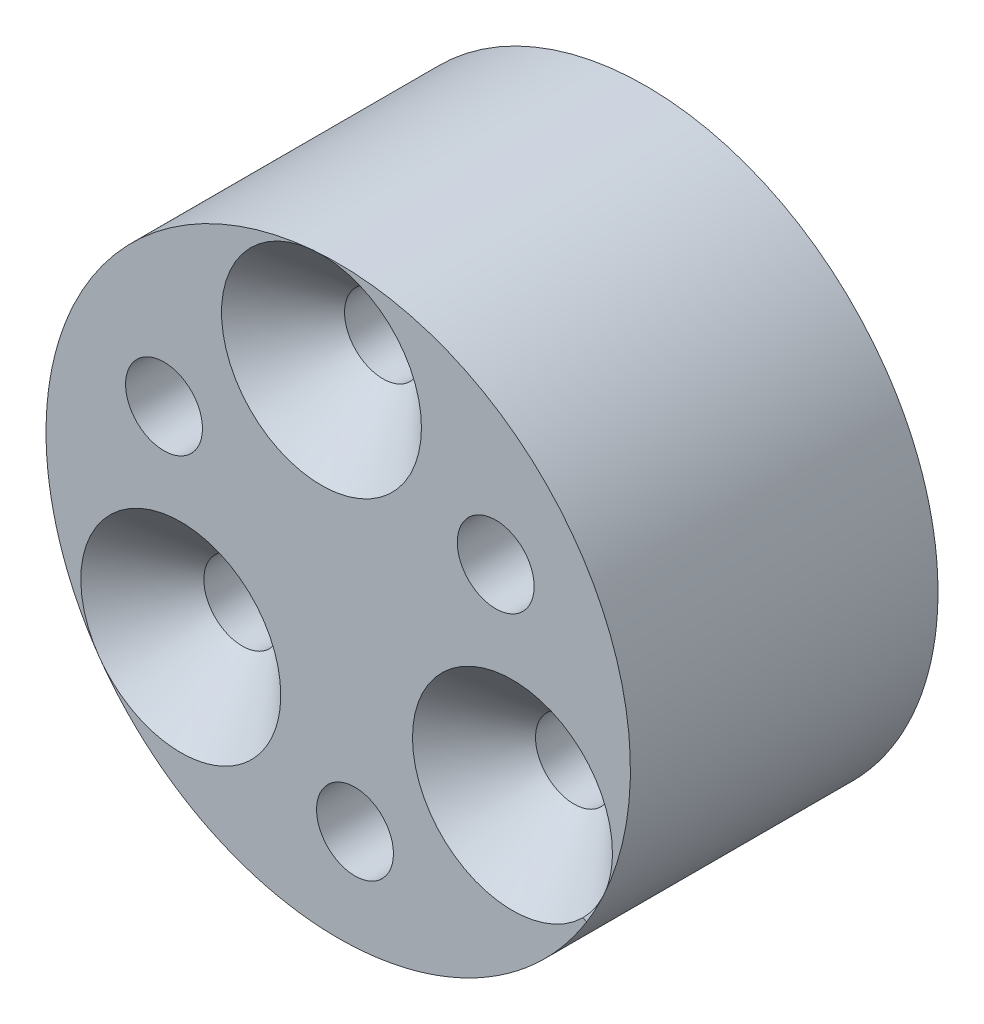
ISO-10303-21;
HEADER;
FILE_DESCRIPTION(('STEP AP214'),'2;1');
FILE_NAME('part.step','',(''),(''),'','','');
FILE_SCHEMA(('AUTOMOTIVE_DESIGN { 1 0 10303 214 1 1 1 1 }'));
ENDSEC;
DATA;
#1=APPLICATION_CONTEXT('core data for automotive mechanical design processes');
#2=APPLICATION_PROTOCOL_DEFINITION('international standard','automotive_design',2000,#1);
#3=PRODUCT_CONTEXT('',#1,'mechanical');
#4=PRODUCT('Part','Part','',(#3));
#5=PRODUCT_RELATED_PRODUCT_CATEGORY('part','',(#4));
#6=PRODUCT_DEFINITION_FORMATION('','',#4);
#7=PRODUCT_DEFINITION_CONTEXT('part definition',#1,'design');
#8=PRODUCT_DEFINITION('design','',#6,#7);
#9=PRODUCT_DEFINITION_SHAPE('','',#8);
#10=(LENGTH_UNIT() NAMED_UNIT(*) SI_UNIT(.MILLI.,.METRE.));
#11=(NAMED_UNIT(*) PLANE_ANGLE_UNIT() SI_UNIT($,.RADIAN.));
#12=(NAMED_UNIT(*) SI_UNIT($,.STERADIAN.) SOLID_ANGLE_UNIT());
#13=UNCERTAINTY_MEASURE_WITH_UNIT(LENGTH_MEASURE(1.E-05),#10,'distance_accuracy_value','');
#14=(GEOMETRIC_REPRESENTATION_CONTEXT(3) GLOBAL_UNCERTAINTY_ASSIGNED_CONTEXT((#13)) GLOBAL_UNIT_ASSIGNED_CONTEXT((#10,
#11,#12)) REPRESENTATION_CONTEXT('',''));
#15=CARTESIAN_POINT('',(0.,0.,0.));
#16=DIRECTION('',(0.,0.,1.));
#17=DIRECTION('',(1.,0.,0.));
#18=AXIS2_PLACEMENT_3D('',#15,#16,#17);
#19=CARTESIAN_POINT('',(0.,-40.,10.));
#20=DIRECTION('',(0.,0.,1.));
#21=DIRECTION('',(1.,0.,0.));
#22=AXIS2_PLACEMENT_3D('',#19,#20,#21);
#23=PLANE('',#22);
#24=CARTESIAN_POINT('',(-5.66442366897909,-37.3586358641206,10.));
#25=DIRECTION('',(0.,0.,1.));
#26=DIRECTION('',(1.,0.,0.));
#27=AXIS2_PLACEMENT_3D('',#24,#25,#26);
#28=CIRCLE('',#27,1.25);
#29=CARTESIAN_POINT('',(-4.41442366897909,-37.3586358641206,10.));
#30=VERTEX_POINT('',#29);
#31=EDGE_CURVE('E178',#30,#30,#28,.T.);
#32=ORIENTED_EDGE('',*,*,#31,.F.);
#33=EDGE_LOOP('',(#32));
#34=FACE_BOUND('',#33,.T.);
#35=CARTESIAN_POINT('',(5.1197002768062,-36.415147272806,10.));
#36=DIRECTION('',(0.,0.,1.));
#37=DIRECTION('',(1.,0.,0.));
#38=AXIS2_PLACEMENT_3D('',#35,#36,#37);
#39=CIRCLE('',#38,1.25);
#40=CARTESIAN_POINT('',(6.3697002768062,-36.415147272806,10.));
#41=VERTEX_POINT('',#40);
#42=EDGE_CURVE('E184',#41,#41,#39,.T.);
#43=ORIENTED_EDGE('',*,*,#42,.F.);
#44=EDGE_LOOP('',(#43));
#45=FACE_BOUND('',#44,.T.);
#46=CARTESIAN_POINT('',(0.,-40.,10.));
#47=DIRECTION('',(0.,0.,1.));
#48=DIRECTION('',(1.,0.,0.));
#49=AXIS2_PLACEMENT_3D('',#46,#47,#48);
#50=CIRCLE('',#49,9.5);
#51=CARTESIAN_POINT('',(8.60992397684817,-44.0148734865367,10.));
#52=VERTEX_POINT('',#51);
#53=CARTESIAN_POINT('',(-0.827979556102756,-30.5361503681284,10.));
#54=VERTEX_POINT('',#53);
#55=EDGE_CURVE('E192',#52,#54,#50,.T.);
#56=ORIENTED_EDGE('',*,*,#55,.T.);
#57=CARTESIAN_POINT('',(-0.544723392172868,-33.7737831369266,10.));
#58=DIRECTION('',(0.,0.,1.));
#59=DIRECTION('',(1.,0.,0.));
#60=AXIS2_PLACEMENT_3D('',#57,#58,#59);
#61=CIRCLE('',#60,3.25000000000001);
#62=EDGE_CURVE('E68',#54,#54,#61,.F.);
#63=ORIENTED_EDGE('',*,*,#62,.T.);
#64=CARTESIAN_POINT('',(-7.78194442074542,-45.4489761453349,10.));
#65=VERTEX_POINT('',#64);
#66=EDGE_CURVE('E188',#54,#65,#50,.T.);
#67=ORIENTED_EDGE('',*,*,#66,.T.);
#68=CARTESIAN_POINT('',(-5.11970027680621,-43.584852727194,10.));
#69=DIRECTION('',(0.,0.,1.));
#70=DIRECTION('',(1.,0.,0.));
#71=AXIS2_PLACEMENT_3D('',#68,#69,#70);
#72=CIRCLE('',#71,3.25000000000001);
#73=EDGE_CURVE('E75',#65,#65,#72,.F.);
#74=ORIENTED_EDGE('',*,*,#73,.T.);
#75=EDGE_CURVE('E191',#65,#52,#50,.T.);
#76=ORIENTED_EDGE('',*,*,#75,.T.);
#77=CARTESIAN_POINT('',(5.66442366897907,-42.6413641358794,10.));
#78=DIRECTION('',(0.,0.,1.));
#79=DIRECTION('',(1.,0.,0.));
#80=AXIS2_PLACEMENT_3D('',#77,#78,#79);
#81=CIRCLE('',#80,3.25000000000001);
#82=EDGE_CURVE('E81',#52,#52,#81,.F.);
#83=ORIENTED_EDGE('',*,*,#82,.T.);
#84=EDGE_LOOP('',(#56,#63,#67,#74,#76,#83));
#85=FACE_BOUND('',#84,.T.);
#86=CARTESIAN_POINT('',(0.544723392172861,-46.2262168630734,10.));
#87=DIRECTION('',(0.,0.,1.));
#88=DIRECTION('',(1.,0.,0.));
#89=AXIS2_PLACEMENT_3D('',#86,#87,#88);
#90=CIRCLE('',#89,1.25);
#91=CARTESIAN_POINT('',(1.79472339217286,-46.2262168630734,10.));
#92=VERTEX_POINT('',#91);
#93=EDGE_CURVE('E181',#92,#92,#90,.T.);
#94=ORIENTED_EDGE('',*,*,#93,.F.);
#95=EDGE_LOOP('',(#94));
#96=FACE_BOUND('',#95,.T.);
#97=ADVANCED_FACE('F35',(#34,#45,#85,#96),#23,.T.);
#98=CARTESIAN_POINT('',(0.,-40.,0.));
#99=DIRECTION('',(0.,0.,1.));
#100=DIRECTION('',(1.,0.,0.));
#101=AXIS2_PLACEMENT_3D('',#98,#99,#100);
#102=PLANE('',#101);
#103=CARTESIAN_POINT('',(0.,-40.,0.));
#104=DIRECTION('',(0.,0.,1.));
#105=DIRECTION('',(1.,0.,0.));
#106=AXIS2_PLACEMENT_3D('',#103,#104,#105);
#107=CIRCLE('',#106,9.5);
#108=CARTESIAN_POINT('',(-8.60992397684818,-35.9851265134634,0.));
#109=VERTEX_POINT('',#108);
#110=CARTESIAN_POINT('',(0.827979556102749,-49.4638496318716,0.));
#111=VERTEX_POINT('',#110);
#112=EDGE_CURVE('E196',#109,#111,#107,.T.);
#113=ORIENTED_EDGE('',*,*,#112,.F.);
#114=CARTESIAN_POINT('',(-5.66442366897909,-37.3586358641206,0.));
#115=DIRECTION('',(0.,0.,1.));
#116=DIRECTION('',(1.,0.,0.));
#117=AXIS2_PLACEMENT_3D('',#114,#115,#116);
#118=CIRCLE('',#117,3.25);
#119=EDGE_CURVE('E54',#109,#109,#118,.T.);
#120=ORIENTED_EDGE('',*,*,#119,.T.);
#121=CARTESIAN_POINT('',(7.78194442074543,-34.5510238546651,0.));
#122=VERTEX_POINT('',#121);
#123=EDGE_CURVE('E193',#122,#109,#107,.T.);
#124=ORIENTED_EDGE('',*,*,#123,.F.);
#125=CARTESIAN_POINT('',(5.1197002768062,-36.415147272806,0.));
#126=DIRECTION('',(0.,0.,1.));
#127=DIRECTION('',(1.,0.,0.));
#128=AXIS2_PLACEMENT_3D('',#125,#126,#127);
#129=CIRCLE('',#128,3.25);
#130=EDGE_CURVE('E87',#122,#122,#129,.T.);
#131=ORIENTED_EDGE('',*,*,#130,.T.);
#132=EDGE_CURVE('E187',#111,#122,#107,.T.);
#133=ORIENTED_EDGE('',*,*,#132,.F.);
#134=CARTESIAN_POINT('',(0.544723392172861,-46.2262168630734,0.));
#135=DIRECTION('',(0.,0.,1.));
#136=DIRECTION('',(1.,0.,0.));
#137=AXIS2_PLACEMENT_3D('',#134,#135,#136);
#138=CIRCLE('',#137,3.25);
#139=EDGE_CURVE('E49',#111,#111,#138,.T.);
#140=ORIENTED_EDGE('',*,*,#139,.T.);
#141=EDGE_LOOP('',(#113,#120,#124,#131,#133,#140));
#142=FACE_BOUND('',#141,.T.);
#143=CARTESIAN_POINT('',(-5.11970027680621,-43.584852727194,0.));
#144=DIRECTION('',(0.,0.,1.));
#145=DIRECTION('',(1.,0.,0.));
#146=AXIS2_PLACEMENT_3D('',#143,#144,#145);
#147=CIRCLE('',#146,1.25);
#148=CARTESIAN_POINT('',(-3.86970027680621,-43.584852727194,0.));
#149=VERTEX_POINT('',#148);
#150=EDGE_CURVE('E173',#149,#149,#147,.T.);
#151=ORIENTED_EDGE('',*,*,#150,.T.);
#152=EDGE_LOOP('',(#151));
#153=FACE_BOUND('',#152,.T.);
#154=CARTESIAN_POINT('',(-0.544723392172868,-33.7737831369266,0.));
#155=DIRECTION('',(0.,0.,1.));
#156=DIRECTION('',(1.,0.,0.));
#157=AXIS2_PLACEMENT_3D('',#154,#155,#156);
#158=CIRCLE('',#157,1.25);
#159=CARTESIAN_POINT('',(0.705276607827134,-33.7737831369266,0.));
#160=VERTEX_POINT('',#159);
#161=EDGE_CURVE('E170',#160,#160,#158,.T.);
#162=ORIENTED_EDGE('',*,*,#161,.T.);
#163=EDGE_LOOP('',(#162));
#164=FACE_BOUND('',#163,.T.);
#165=CARTESIAN_POINT('',(5.66442366897907,-42.6413641358794,0.));
#166=DIRECTION('',(0.,0.,1.));
#167=DIRECTION('',(1.,0.,0.));
#168=AXIS2_PLACEMENT_3D('',#165,#166,#167);
#169=CIRCLE('',#168,1.25);
#170=CARTESIAN_POINT('',(6.91442366897907,-42.6413641358794,0.));
#171=VERTEX_POINT('',#170);
#172=EDGE_CURVE('E168',#171,#171,#169,.T.);
#173=ORIENTED_EDGE('',*,*,#172,.T.);
#174=EDGE_LOOP('',(#173));
#175=FACE_BOUND('',#174,.T.);
#176=ADVANCED_FACE('F113',(#142,#153,#164,#175),#102,.F.);
#177=CARTESIAN_POINT('',(0.,-40.,10.));
#178=DIRECTION('',(0.,0.,-1.));
#179=DIRECTION('',(-1.,0.,0.));
#180=AXIS2_PLACEMENT_3D('',#177,#178,#179);
#181=CYLINDRICAL_SURFACE('',#180,9.5);
#182=ORIENTED_EDGE('',*,*,#66,.F.);
#183=ORIENTED_EDGE('',*,*,#55,.F.);
#184=ORIENTED_EDGE('',*,*,#75,.F.);
#185=EDGE_LOOP('',(#182,#183,#184));
#186=FACE_BOUND('',#185,.T.);
#187=ORIENTED_EDGE('',*,*,#123,.T.);
#188=ORIENTED_EDGE('',*,*,#112,.T.);
#189=ORIENTED_EDGE('',*,*,#132,.T.);
#190=EDGE_LOOP('',(#187,#188,#189));
#191=FACE_BOUND('',#190,.T.);
#192=ADVANCED_FACE('F119',(#186,#191),#181,.T.);
#193=CARTESIAN_POINT('',(5.1197002768062,-36.415147272806,10.));
#194=DIRECTION('',(0.,0.,-1.));
#195=DIRECTION('',(-1.,0.,0.));
#196=AXIS2_PLACEMENT_3D('',#193,#194,#195);
#197=CYLINDRICAL_SURFACE('',#196,1.25);
#198=CARTESIAN_POINT('',(5.1197002768062,-36.415147272806,2.00000000000001));
#199=DIRECTION('',(0.,0.,1.));
#200=DIRECTION('',(1.,0.,0.));
#201=AXIS2_PLACEMENT_3D('',#198,#199,#200);
#202=CIRCLE('',#201,1.25);
#203=CARTESIAN_POINT('',(6.3697002768062,-36.415147272806,2.00000000000001));
#204=VERTEX_POINT('',#203);
#205=EDGE_CURVE('E11',#204,#204,#202,.F.);
#206=ORIENTED_EDGE('',*,*,#205,.T.);
#207=EDGE_LOOP('',(#206));
#208=FACE_BOUND('',#207,.T.);
#209=ORIENTED_EDGE('',*,*,#42,.T.);
#210=EDGE_LOOP('',(#209));
#211=FACE_BOUND('',#210,.T.);
#212=ADVANCED_FACE('F125',(#208,#211),#197,.F.);
#213=CARTESIAN_POINT('',(0.544723392172861,-46.2262168630734,10.));
#214=DIRECTION('',(0.,0.,-1.));
#215=DIRECTION('',(-1.,0.,0.));
#216=AXIS2_PLACEMENT_3D('',#213,#214,#215);
#217=CYLINDRICAL_SURFACE('',#216,1.25);
#218=CARTESIAN_POINT('',(0.544723392172861,-46.2262168630734,2.00000000000001));
#219=DIRECTION('',(0.,0.,1.));
#220=DIRECTION('',(1.,0.,0.));
#221=AXIS2_PLACEMENT_3D('',#218,#219,#220);
#222=CIRCLE('',#221,1.25);
#223=CARTESIAN_POINT('',(1.79472339217286,-46.2262168630734,2.00000000000001));
#224=VERTEX_POINT('',#223);
#225=EDGE_CURVE('E44',#224,#224,#222,.F.);
#226=ORIENTED_EDGE('',*,*,#225,.T.);
#227=EDGE_LOOP('',(#226));
#228=FACE_BOUND('',#227,.T.);
#229=ORIENTED_EDGE('',*,*,#93,.T.);
#230=EDGE_LOOP('',(#229));
#231=FACE_BOUND('',#230,.T.);
#232=ADVANCED_FACE('F97',(#228,#231),#217,.F.);
#233=CARTESIAN_POINT('',(-5.66442366897909,-37.3586358641206,10.));
#234=DIRECTION('',(0.,0.,-1.));
#235=DIRECTION('',(-1.,0.,0.));
#236=AXIS2_PLACEMENT_3D('',#233,#234,#235);
#237=CYLINDRICAL_SURFACE('',#236,1.25);
#238=CARTESIAN_POINT('',(-5.66442366897909,-37.3586358641206,2.00000000000001));
#239=DIRECTION('',(0.,0.,1.));
#240=DIRECTION('',(1.,0.,0.));
#241=AXIS2_PLACEMENT_3D('',#238,#239,#240);
#242=CIRCLE('',#241,1.25);
#243=CARTESIAN_POINT('',(-4.41442366897909,-37.3586358641206,2.00000000000001));
#244=VERTEX_POINT('',#243);
#245=EDGE_CURVE('E92',#244,#244,#242,.F.);
#246=ORIENTED_EDGE('',*,*,#245,.T.);
#247=EDGE_LOOP('',(#246));
#248=FACE_BOUND('',#247,.T.);
#249=ORIENTED_EDGE('',*,*,#31,.T.);
#250=EDGE_LOOP('',(#249));
#251=FACE_BOUND('',#250,.T.);
#252=ADVANCED_FACE('F210',(#248,#251),#237,.F.);
#253=CARTESIAN_POINT('',(-5.11970027680621,-43.584852727194,10.));
#254=DIRECTION('',(0.,0.,-1.));
#255=DIRECTION('',(-1.,0.,0.));
#256=AXIS2_PLACEMENT_3D('',#253,#254,#255);
#257=CYLINDRICAL_SURFACE('',#256,1.25);
#258=CARTESIAN_POINT('',(-5.11970027680621,-43.584852727194,7.99999999999999));
#259=DIRECTION('',(0.,0.,1.));
#260=DIRECTION('',(1.,0.,0.));
#261=AXIS2_PLACEMENT_3D('',#258,#259,#260);
#262=CIRCLE('',#261,1.25);
#263=CARTESIAN_POINT('',(-3.86970027680621,-43.584852727194,7.99999999999999));
#264=VERTEX_POINT('',#263);
#265=EDGE_CURVE('E74',#264,#264,#262,.T.);
#266=ORIENTED_EDGE('',*,*,#265,.T.);
#267=EDGE_LOOP('',(#266));
#268=FACE_BOUND('',#267,.T.);
#269=ORIENTED_EDGE('',*,*,#150,.F.);
#270=EDGE_LOOP('',(#269));
#271=FACE_BOUND('',#270,.T.);
#272=ADVANCED_FACE('F207',(#268,#271),#257,.F.);
#273=CARTESIAN_POINT('',(-0.544723392172868,-33.7737831369266,10.));
#274=DIRECTION('',(0.,0.,-1.));
#275=DIRECTION('',(-1.,0.,0.));
#276=AXIS2_PLACEMENT_3D('',#273,#274,#275);
#277=CYLINDRICAL_SURFACE('',#276,1.25);
#278=CARTESIAN_POINT('',(-0.544723392172868,-33.7737831369266,8.00000000000001));
#279=DIRECTION('',(0.,0.,1.));
#280=DIRECTION('',(1.,0.,0.));
#281=AXIS2_PLACEMENT_3D('',#278,#279,#280);
#282=CIRCLE('',#281,1.25);
#283=CARTESIAN_POINT('',(0.705276607827134,-33.7737831369266,8.00000000000001));
#284=VERTEX_POINT('',#283);
#285=EDGE_CURVE('E190',#284,#284,#282,.T.);
#286=ORIENTED_EDGE('',*,*,#285,.T.);
#287=EDGE_LOOP('',(#286));
#288=FACE_BOUND('',#287,.T.);
#289=ORIENTED_EDGE('',*,*,#161,.F.);
#290=EDGE_LOOP('',(#289));
#291=FACE_BOUND('',#290,.T.);
#292=ADVANCED_FACE('F164',(#288,#291),#277,.F.);
#293=CARTESIAN_POINT('',(5.66442366897907,-42.6413641358794,10.));
#294=DIRECTION('',(0.,0.,-1.));
#295=DIRECTION('',(-1.,0.,0.));
#296=AXIS2_PLACEMENT_3D('',#293,#294,#295);
#297=CYLINDRICAL_SURFACE('',#296,1.25);
#298=CARTESIAN_POINT('',(5.66442366897907,-42.6413641358794,7.99999999999999));
#299=DIRECTION('',(0.,0.,1.));
#300=DIRECTION('',(1.,0.,0.));
#301=AXIS2_PLACEMENT_3D('',#298,#299,#300);
#302=CIRCLE('',#301,1.25);
#303=CARTESIAN_POINT('',(6.91442366897907,-42.6413641358794,7.99999999999999));
#304=VERTEX_POINT('',#303);
#305=EDGE_CURVE('E78',#304,#304,#302,.T.);
#306=ORIENTED_EDGE('',*,*,#305,.T.);
#307=EDGE_LOOP('',(#306));
#308=FACE_BOUND('',#307,.T.);
#309=ORIENTED_EDGE('',*,*,#172,.F.);
#310=EDGE_LOOP('',(#309));
#311=FACE_BOUND('',#310,.T.);
#312=ADVANCED_FACE('F138',(#308,#311),#297,.F.);
#313=CARTESIAN_POINT('',(-0.544723392172868,-33.7737831369266,8.00000000000001));
#314=DIRECTION('',(0.,0.,1.));
#315=DIRECTION('',(1.,0.,0.));
#316=AXIS2_PLACEMENT_3D('',#313,#314,#315);
#317=CONICAL_SURFACE('',#316,1.25,0.785398163397451);
#318=ORIENTED_EDGE('',*,*,#62,.F.);
#319=EDGE_LOOP('',(#318));
#320=FACE_BOUND('',#319,.T.);
#321=ORIENTED_EDGE('',*,*,#285,.F.);
#322=EDGE_LOOP('',(#321));
#323=FACE_BOUND('',#322,.T.);
#324=ADVANCED_FACE('F69',(#320,#323),#317,.F.);
#325=CARTESIAN_POINT('',(-5.11970027680621,-43.584852727194,7.99999999999999));
#326=DIRECTION('',(0.,0.,1.));
#327=DIRECTION('',(1.,0.,0.));
#328=AXIS2_PLACEMENT_3D('',#325,#326,#327);
#329=CONICAL_SURFACE('',#328,1.25,0.78539816339745);
#330=ORIENTED_EDGE('',*,*,#73,.F.);
#331=EDGE_LOOP('',(#330));
#332=FACE_BOUND('',#331,.T.);
#333=ORIENTED_EDGE('',*,*,#265,.F.);
#334=EDGE_LOOP('',(#333));
#335=FACE_BOUND('',#334,.T.);
#336=ADVANCED_FACE('F137',(#332,#335),#329,.F.);
#337=CARTESIAN_POINT('',(5.66442366897907,-42.6413641358794,7.99999999999999));
#338=DIRECTION('',(0.,0.,1.));
#339=DIRECTION('',(1.,0.,0.));
#340=AXIS2_PLACEMENT_3D('',#337,#338,#339);
#341=CONICAL_SURFACE('',#340,1.25,0.78539816339745);
#342=ORIENTED_EDGE('',*,*,#82,.F.);
#343=EDGE_LOOP('',(#342));
#344=FACE_BOUND('',#343,.T.);
#345=ORIENTED_EDGE('',*,*,#305,.F.);
#346=EDGE_LOOP('',(#345));
#347=FACE_BOUND('',#346,.T.);
#348=ADVANCED_FACE('F108',(#344,#347),#341,.F.);
#349=CARTESIAN_POINT('',(-5.66442366897909,-37.3586358641206,0.));
#350=DIRECTION('',(0.,0.,-1.));
#351=DIRECTION('',(-1.,0.,0.));
#352=AXIS2_PLACEMENT_3D('',#349,#350,#351);
#353=CONICAL_SURFACE('',#352,3.25,0.785398163397446);
#354=ORIENTED_EDGE('',*,*,#245,.F.);
#355=EDGE_LOOP('',(#354));
#356=FACE_BOUND('',#355,.T.);
#357=ORIENTED_EDGE('',*,*,#119,.F.);
#358=EDGE_LOOP('',(#357));
#359=FACE_BOUND('',#358,.T.);
#360=ADVANCED_FACE('F102',(#356,#359),#353,.F.);
#361=CARTESIAN_POINT('',(0.544723392172861,-46.2262168630734,0.));
#362=DIRECTION('',(0.,0.,-1.));
#363=DIRECTION('',(-1.,0.,0.));
#364=AXIS2_PLACEMENT_3D('',#361,#362,#363);
#365=CONICAL_SURFACE('',#364,3.25,0.785398163397446);
#366=ORIENTED_EDGE('',*,*,#225,.F.);
#367=EDGE_LOOP('',(#366));
#368=FACE_BOUND('',#367,.T.);
#369=ORIENTED_EDGE('',*,*,#139,.F.);
#370=EDGE_LOOP('',(#369));
#371=FACE_BOUND('',#370,.T.);
#372=ADVANCED_FACE('F100',(#368,#371),#365,.F.);
#373=CARTESIAN_POINT('',(5.1197002768062,-36.415147272806,0.));
#374=DIRECTION('',(0.,0.,-1.));
#375=DIRECTION('',(-1.,0.,0.));
#376=AXIS2_PLACEMENT_3D('',#373,#374,#375);
#377=CONICAL_SURFACE('',#376,3.25,0.785398163397446);
#378=ORIENTED_EDGE('',*,*,#205,.F.);
#379=EDGE_LOOP('',(#378));
#380=FACE_BOUND('',#379,.T.);
#381=ORIENTED_EDGE('',*,*,#130,.F.);
#382=EDGE_LOOP('',(#381));
#383=FACE_BOUND('',#382,.T.);
#384=ADVANCED_FACE('F38',(#380,#383),#377,.F.);
#385=CLOSED_SHELL('',(#97,#176,#192,#212,#232,#252,#272,#292,#312,#324,#336,#348,#360,#372,#384));
#386=MANIFOLD_SOLID_BREP('B2',#385);
#387=ADVANCED_BREP_SHAPE_REPRESENTATION('',(#18,#386),#14);
#388=SHAPE_DEFINITION_REPRESENTATION(#9,#387);
ENDSEC;
END-ISO-10303-21;
